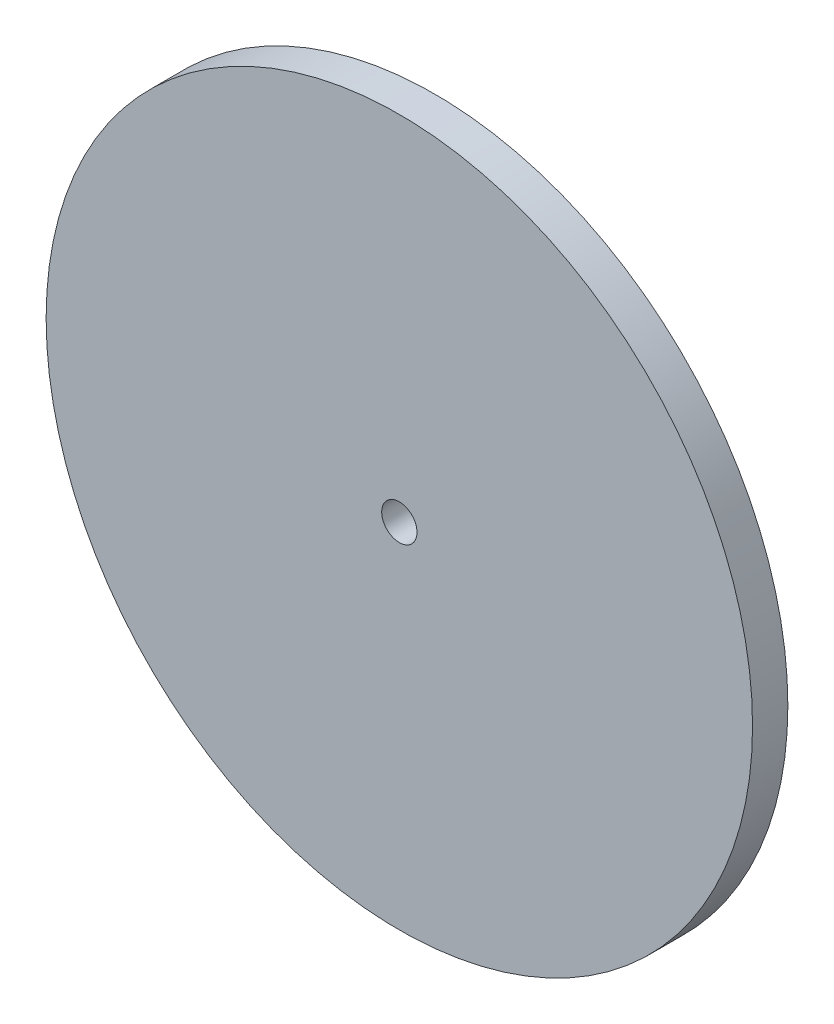
ISO-10303-21;
HEADER;
FILE_DESCRIPTION(('STEP AP214'),'2;1');
FILE_NAME('part.step','',(''),(''),'','','');
FILE_SCHEMA(('AUTOMOTIVE_DESIGN { 1 0 10303 214 1 1 1 1 }'));
ENDSEC;
DATA;
#1=APPLICATION_CONTEXT('core data for automotive mechanical design processes');
#2=APPLICATION_PROTOCOL_DEFINITION('international standard','automotive_design',2000,#1);
#3=PRODUCT_CONTEXT('',#1,'mechanical');
#4=PRODUCT('Part','Part','',(#3));
#5=PRODUCT_RELATED_PRODUCT_CATEGORY('part','',(#4));
#6=PRODUCT_DEFINITION_FORMATION('','',#4);
#7=PRODUCT_DEFINITION_CONTEXT('part definition',#1,'design');
#8=PRODUCT_DEFINITION('design','',#6,#7);
#9=PRODUCT_DEFINITION_SHAPE('','',#8);
#10=(LENGTH_UNIT() NAMED_UNIT(*) SI_UNIT(.MILLI.,.METRE.));
#11=(NAMED_UNIT(*) PLANE_ANGLE_UNIT() SI_UNIT($,.RADIAN.));
#12=(NAMED_UNIT(*) SI_UNIT($,.STERADIAN.) SOLID_ANGLE_UNIT());
#13=UNCERTAINTY_MEASURE_WITH_UNIT(LENGTH_MEASURE(1.E-05),#10,'distance_accuracy_value','');
#14=(GEOMETRIC_REPRESENTATION_CONTEXT(3) GLOBAL_UNCERTAINTY_ASSIGNED_CONTEXT((#13)) GLOBAL_UNIT_ASSIGNED_CONTEXT((#10,
#11,#12)) REPRESENTATION_CONTEXT('',''));
#15=CARTESIAN_POINT('',(0.,0.,0.));
#16=DIRECTION('',(0.,0.,1.));
#17=DIRECTION('',(1.,0.,0.));
#18=AXIS2_PLACEMENT_3D('',#15,#16,#17);
#19=CARTESIAN_POINT('',(0.,0.,6.35));
#20=DIRECTION('',(0.,0.,1.));
#21=DIRECTION('',(1.,0.,0.));
#22=AXIS2_PLACEMENT_3D('',#19,#20,#21);
#23=PLANE('',#22);
#24=CARTESIAN_POINT('',(0.,0.,6.35));
#25=DIRECTION('',(0.,0.,1.));
#26=DIRECTION('',(1.,0.,0.));
#27=AXIS2_PLACEMENT_3D('',#24,#25,#26);
#28=CIRCLE('',#27,63.5);
#29=CARTESIAN_POINT('',(63.5,0.,6.35));
#30=VERTEX_POINT('',#29);
#31=EDGE_CURVE('E10',#30,#30,#28,.T.);
#32=ORIENTED_EDGE('',*,*,#31,.T.);
#33=EDGE_LOOP('',(#32));
#34=FACE_BOUND('',#33,.T.);
#35=CARTESIAN_POINT('',(0.,0.,6.35));
#36=DIRECTION('',(0.,0.,1.));
#37=DIRECTION('',(1.,0.,0.));
#38=AXIS2_PLACEMENT_3D('',#35,#36,#37);
#39=CIRCLE('',#38,3.175);
#40=CARTESIAN_POINT('',(3.175,0.,6.35));
#41=VERTEX_POINT('',#40);
#42=EDGE_CURVE('E42',#41,#41,#39,.T.);
#43=ORIENTED_EDGE('',*,*,#42,.F.);
#44=EDGE_LOOP('',(#43));
#45=FACE_BOUND('',#44,.T.);
#46=ADVANCED_FACE('F31',(#34,#45),#23,.T.);
#47=CARTESIAN_POINT('',(0.,0.,0.));
#48=DIRECTION('',(0.,0.,1.));
#49=DIRECTION('',(1.,0.,0.));
#50=AXIS2_PLACEMENT_3D('',#47,#48,#49);
#51=PLANE('',#50);
#52=CARTESIAN_POINT('',(0.,0.,0.));
#53=DIRECTION('',(0.,0.,1.));
#54=DIRECTION('',(1.,0.,0.));
#55=AXIS2_PLACEMENT_3D('',#52,#53,#54);
#56=CIRCLE('',#55,63.5);
#57=CARTESIAN_POINT('',(63.5,0.,0.));
#58=VERTEX_POINT('',#57);
#59=EDGE_CURVE('E35',#58,#58,#56,.T.);
#60=ORIENTED_EDGE('',*,*,#59,.F.);
#61=EDGE_LOOP('',(#60));
#62=FACE_BOUND('',#61,.T.);
#63=CARTESIAN_POINT('',(0.,0.,0.));
#64=DIRECTION('',(0.,0.,1.));
#65=DIRECTION('',(1.,0.,0.));
#66=AXIS2_PLACEMENT_3D('',#63,#64,#65);
#67=CIRCLE('',#66,3.175);
#68=CARTESIAN_POINT('',(3.175,0.,0.));
#69=VERTEX_POINT('',#68);
#70=EDGE_CURVE('E44',#69,#69,#67,.T.);
#71=ORIENTED_EDGE('',*,*,#70,.T.);
#72=EDGE_LOOP('',(#71));
#73=FACE_BOUND('',#72,.T.);
#74=ADVANCED_FACE('F54',(#62,#73),#51,.F.);
#75=CARTESIAN_POINT('',(0.,0.,6.35));
#76=DIRECTION('',(0.,0.,-1.));
#77=DIRECTION('',(-1.,0.,0.));
#78=AXIS2_PLACEMENT_3D('',#75,#76,#77);
#79=CYLINDRICAL_SURFACE('',#78,63.5);
#80=ORIENTED_EDGE('',*,*,#31,.F.);
#81=EDGE_LOOP('',(#80));
#82=FACE_BOUND('',#81,.T.);
#83=ORIENTED_EDGE('',*,*,#59,.T.);
#84=EDGE_LOOP('',(#83));
#85=FACE_BOUND('',#84,.T.);
#86=ADVANCED_FACE('F33',(#82,#85),#79,.T.);
#87=CARTESIAN_POINT('',(0.,0.,6.35));
#88=DIRECTION('',(0.,0.,-1.));
#89=DIRECTION('',(-1.,0.,0.));
#90=AXIS2_PLACEMENT_3D('',#87,#88,#89);
#91=CYLINDRICAL_SURFACE('',#90,3.175);
#92=ORIENTED_EDGE('',*,*,#42,.T.);
#93=EDGE_LOOP('',(#92));
#94=FACE_BOUND('',#93,.T.);
#95=ORIENTED_EDGE('',*,*,#70,.F.);
#96=EDGE_LOOP('',(#95));
#97=FACE_BOUND('',#96,.T.);
#98=ADVANCED_FACE('F50',(#94,#97),#91,.F.);
#99=CLOSED_SHELL('',(#46,#74,#86,#98));
#100=MANIFOLD_SOLID_BREP('B2',#99);
#101=ADVANCED_BREP_SHAPE_REPRESENTATION('',(#18,#100),#14);
#102=SHAPE_DEFINITION_REPRESENTATION(#9,#101);
ENDSEC;
END-ISO-10303-21;
